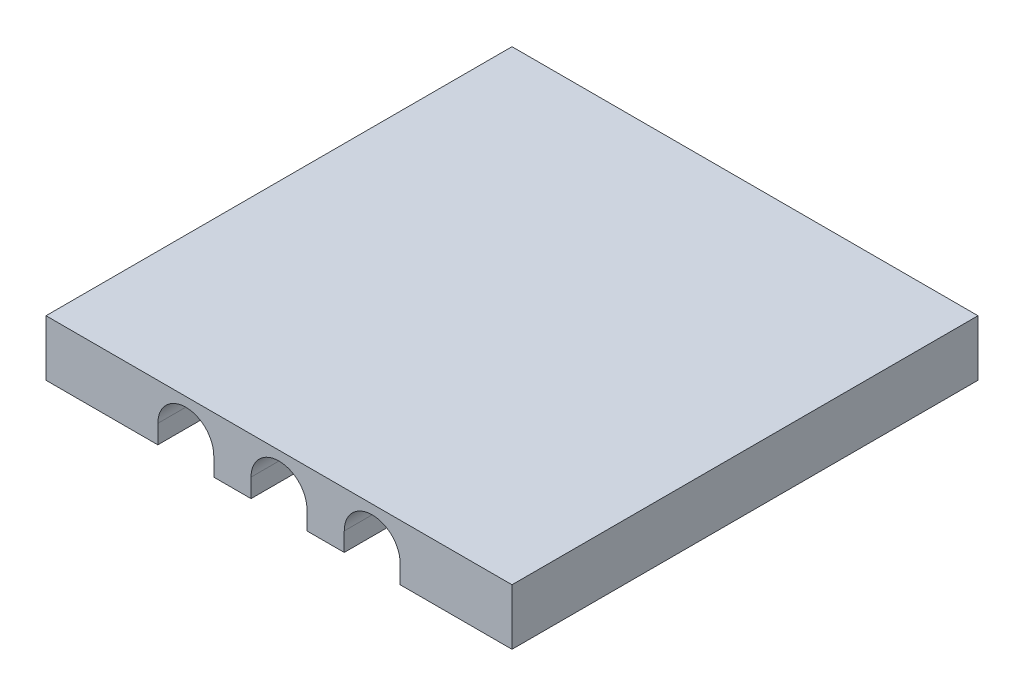
ISO-10303-21;
HEADER;
FILE_DESCRIPTION(('STEP AP214'),'2;1');
FILE_NAME('part.step','',(''),(''),'','','');
FILE_SCHEMA(('AUTOMOTIVE_DESIGN { 1 0 10303 214 1 1 1 1 }'));
ENDSEC;
DATA;
#1=APPLICATION_CONTEXT('core data for automotive mechanical design processes');
#2=APPLICATION_PROTOCOL_DEFINITION('international standard','automotive_design',2000,#1);
#3=PRODUCT_CONTEXT('',#1,'mechanical');
#4=PRODUCT('Part','Part','',(#3));
#5=PRODUCT_RELATED_PRODUCT_CATEGORY('part','',(#4));
#6=PRODUCT_DEFINITION_FORMATION('','',#4);
#7=PRODUCT_DEFINITION_CONTEXT('part definition',#1,'design');
#8=PRODUCT_DEFINITION('design','',#6,#7);
#9=PRODUCT_DEFINITION_SHAPE('','',#8);
#10=(LENGTH_UNIT() NAMED_UNIT(*) SI_UNIT(.MILLI.,.METRE.));
#11=(NAMED_UNIT(*) PLANE_ANGLE_UNIT() SI_UNIT($,.RADIAN.));
#12=(NAMED_UNIT(*) SI_UNIT($,.STERADIAN.) SOLID_ANGLE_UNIT());
#13=UNCERTAINTY_MEASURE_WITH_UNIT(LENGTH_MEASURE(1.E-05),#10,'distance_accuracy_value','');
#14=(GEOMETRIC_REPRESENTATION_CONTEXT(3) GLOBAL_UNCERTAINTY_ASSIGNED_CONTEXT((#13)) GLOBAL_UNIT_ASSIGNED_CONTEXT((#10,
#11,#12)) REPRESENTATION_CONTEXT('',''));
#15=CARTESIAN_POINT('',(0.,0.,0.));
#16=DIRECTION('',(0.,0.,1.));
#17=DIRECTION('',(1.,0.,0.));
#18=AXIS2_PLACEMENT_3D('',#15,#16,#17);
#19=CARTESIAN_POINT('',(-25.,-3.,25.));
#20=DIRECTION('',(0.,1.,0.));
#21=DIRECTION('',(0.,0.,1.));
#22=AXIS2_PLACEMENT_3D('',#19,#20,#21);
#23=PLANE('',#22);
#24=DIRECTION('',(1.,0.,0.));
#25=VECTOR('',#24,1.);
#26=CARTESIAN_POINT('',(-25.,-3.,25.));
#27=LINE('',#26,#25);
#28=CARTESIAN_POINT('',(-7.,-3.,25.));
#29=VERTEX_POINT('',#28);
#30=CARTESIAN_POINT('',(-3.,-3.,25.));
#31=VERTEX_POINT('',#30);
#32=EDGE_CURVE('E243',#29,#31,#27,.T.);
#33=ORIENTED_EDGE('',*,*,#32,.F.);
#34=DIRECTION('',(0.,0.,1.));
#35=VECTOR('',#34,1.);
#36=CARTESIAN_POINT('',(-7.,-3.,-25.001));
#37=LINE('',#36,#35);
#38=CARTESIAN_POINT('',(-7.,-3.,-25.));
#39=VERTEX_POINT('',#38);
#40=EDGE_CURVE('E179',#39,#29,#37,.T.);
#41=ORIENTED_EDGE('',*,*,#40,.F.);
#42=DIRECTION('',(1.,0.,0.));
#43=VECTOR('',#42,1.);
#44=CARTESIAN_POINT('',(-25.,-3.,-25.));
#45=LINE('',#44,#43);
#46=CARTESIAN_POINT('',(-3.,-3.,-25.));
#47=VERTEX_POINT('',#46);
#48=EDGE_CURVE('E253',#39,#47,#45,.T.);
#49=ORIENTED_EDGE('',*,*,#48,.T.);
#50=DIRECTION('',(0.,0.,1.));
#51=VECTOR('',#50,1.);
#52=CARTESIAN_POINT('',(-3.,-3.,-25.001));
#53=LINE('',#52,#51);
#54=EDGE_CURVE('E223',#47,#31,#53,.T.);
#55=ORIENTED_EDGE('',*,*,#54,.T.);
#56=EDGE_LOOP('',(#33,#41,#49,#55));
#57=FACE_BOUND('',#56,.T.);
#58=ADVANCED_FACE('F34',(#57),#23,.F.);
#59=CARTESIAN_POINT('',(13.,-3.,25.));
#60=VERTEX_POINT('',#59);
#61=CARTESIAN_POINT('',(25.,-3.,25.));
#62=VERTEX_POINT('',#61);
#63=EDGE_CURVE('E238',#60,#62,#27,.T.);
#64=ORIENTED_EDGE('',*,*,#63,.F.);
#65=DIRECTION('',(0.,0.,1.));
#66=VECTOR('',#65,1.);
#67=CARTESIAN_POINT('',(13.,-3.,-25.001));
#68=LINE('',#67,#66);
#69=CARTESIAN_POINT('',(13.,-3.,-25.));
#70=VERTEX_POINT('',#69);
#71=EDGE_CURVE('E198',#70,#60,#68,.T.);
#72=ORIENTED_EDGE('',*,*,#71,.F.);
#73=CARTESIAN_POINT('',(25.,-3.,-25.));
#74=VERTEX_POINT('',#73);
#75=EDGE_CURVE('E251',#70,#74,#45,.T.);
#76=ORIENTED_EDGE('',*,*,#75,.T.);
#77=DIRECTION('',(0.,0.,-1.));
#78=VECTOR('',#77,1.);
#79=CARTESIAN_POINT('',(25.,-3.,25.));
#80=LINE('',#79,#78);
#81=EDGE_CURVE('E242',#62,#74,#80,.T.);
#82=ORIENTED_EDGE('',*,*,#81,.F.);
#83=EDGE_LOOP('',(#64,#72,#76,#82));
#84=FACE_BOUND('',#83,.T.);
#85=ADVANCED_FACE('F304',(#84),#23,.F.);
#86=CARTESIAN_POINT('',(3.,-3.,-25.));
#87=VERTEX_POINT('',#86);
#88=CARTESIAN_POINT('',(7.,-3.,-25.));
#89=VERTEX_POINT('',#88);
#90=EDGE_CURVE('E254',#87,#89,#45,.T.);
#91=ORIENTED_EDGE('',*,*,#90,.T.);
#92=DIRECTION('',(0.,0.,1.));
#93=VECTOR('',#92,1.);
#94=CARTESIAN_POINT('',(7.,-3.,-25.001));
#95=LINE('',#94,#93);
#96=CARTESIAN_POINT('',(7.,-3.,25.));
#97=VERTEX_POINT('',#96);
#98=EDGE_CURVE('E57',#89,#97,#95,.T.);
#99=ORIENTED_EDGE('',*,*,#98,.T.);
#100=CARTESIAN_POINT('',(3.,-3.,25.));
#101=VERTEX_POINT('',#100);
#102=EDGE_CURVE('E244',#101,#97,#27,.T.);
#103=ORIENTED_EDGE('',*,*,#102,.F.);
#104=DIRECTION('',(0.,0.,1.));
#105=VECTOR('',#104,1.);
#106=CARTESIAN_POINT('',(3.,-3.,-25.001));
#107=LINE('',#106,#105);
#108=EDGE_CURVE('E221',#87,#101,#107,.T.);
#109=ORIENTED_EDGE('',*,*,#108,.F.);
#110=EDGE_LOOP('',(#91,#99,#103,#109));
#111=FACE_BOUND('',#110,.T.);
#112=ADVANCED_FACE('F306',(#111),#23,.F.);
#113=CARTESIAN_POINT('',(25.,3.,25.));
#114=DIRECTION('',(-1.,0.,0.));
#115=DIRECTION('',(0.,0.,1.));
#116=AXIS2_PLACEMENT_3D('',#113,#114,#115);
#117=PLANE('',#116);
#118=DIRECTION('',(0.,1.,0.));
#119=VECTOR('',#118,1.);
#120=CARTESIAN_POINT('',(25.,3.,-25.));
#121=LINE('',#120,#119);
#122=CARTESIAN_POINT('',(25.,3.,-25.));
#123=VERTEX_POINT('',#122);
#124=EDGE_CURVE('E229',#74,#123,#121,.T.);
#125=ORIENTED_EDGE('',*,*,#124,.T.);
#126=DIRECTION('',(0.,0.,-1.));
#127=VECTOR('',#126,1.);
#128=CARTESIAN_POINT('',(25.,3.,25.));
#129=LINE('',#128,#127);
#130=CARTESIAN_POINT('',(25.,3.,25.));
#131=VERTEX_POINT('',#130);
#132=EDGE_CURVE('E11',#131,#123,#129,.T.);
#133=ORIENTED_EDGE('',*,*,#132,.F.);
#134=DIRECTION('',(0.,1.,0.));
#135=VECTOR('',#134,1.);
#136=CARTESIAN_POINT('',(25.,3.,25.));
#137=LINE('',#136,#135);
#138=EDGE_CURVE('E230',#62,#131,#137,.T.);
#139=ORIENTED_EDGE('',*,*,#138,.F.);
#140=ORIENTED_EDGE('',*,*,#81,.T.);
#141=EDGE_LOOP('',(#125,#133,#139,#140));
#142=FACE_BOUND('',#141,.T.);
#143=ADVANCED_FACE('F36',(#142),#117,.F.);
#144=CARTESIAN_POINT('',(-25.,3.,25.));
#145=DIRECTION('',(0.,-1.,0.));
#146=DIRECTION('',(0.,0.,-1.));
#147=AXIS2_PLACEMENT_3D('',#144,#145,#146);
#148=PLANE('',#147);
#149=DIRECTION('',(-1.,0.,0.));
#150=VECTOR('',#149,1.);
#151=CARTESIAN_POINT('',(-25.,3.,-25.));
#152=LINE('',#151,#150);
#153=CARTESIAN_POINT('',(-25.,3.,-25.));
#154=VERTEX_POINT('',#153);
#155=EDGE_CURVE('E247',#123,#154,#152,.T.);
#156=ORIENTED_EDGE('',*,*,#155,.T.);
#157=DIRECTION('',(0.,0.,-1.));
#158=VECTOR('',#157,1.);
#159=CARTESIAN_POINT('',(-25.,3.,25.));
#160=LINE('',#159,#158);
#161=CARTESIAN_POINT('',(-25.,3.,25.));
#162=VERTEX_POINT('',#161);
#163=EDGE_CURVE('E42',#162,#154,#160,.T.);
#164=ORIENTED_EDGE('',*,*,#163,.F.);
#165=DIRECTION('',(-1.,0.,0.));
#166=VECTOR('',#165,1.);
#167=CARTESIAN_POINT('',(-25.,3.,25.));
#168=LINE('',#167,#166);
#169=EDGE_CURVE('E233',#131,#162,#168,.T.);
#170=ORIENTED_EDGE('',*,*,#169,.F.);
#171=ORIENTED_EDGE('',*,*,#132,.T.);
#172=EDGE_LOOP('',(#156,#164,#170,#171));
#173=FACE_BOUND('',#172,.T.);
#174=ADVANCED_FACE('F276',(#173),#148,.F.);
#175=CARTESIAN_POINT('',(-25.,3.,25.));
#176=DIRECTION('',(1.,0.,0.));
#177=DIRECTION('',(0.,0.,-1.));
#178=AXIS2_PLACEMENT_3D('',#175,#176,#177);
#179=PLANE('',#178);
#180=DIRECTION('',(0.,-1.,0.));
#181=VECTOR('',#180,1.);
#182=CARTESIAN_POINT('',(-25.,3.,-25.));
#183=LINE('',#182,#181);
#184=CARTESIAN_POINT('',(-25.,-3.,-25.));
#185=VERTEX_POINT('',#184);
#186=EDGE_CURVE('E249',#154,#185,#183,.T.);
#187=ORIENTED_EDGE('',*,*,#186,.T.);
#188=DIRECTION('',(0.,0.,-1.));
#189=VECTOR('',#188,1.);
#190=CARTESIAN_POINT('',(-25.,-3.,25.));
#191=LINE('',#190,#189);
#192=CARTESIAN_POINT('',(-25.,-3.,25.));
#193=VERTEX_POINT('',#192);
#194=EDGE_CURVE('E257',#193,#185,#191,.T.);
#195=ORIENTED_EDGE('',*,*,#194,.F.);
#196=DIRECTION('',(0.,-1.,0.));
#197=VECTOR('',#196,1.);
#198=CARTESIAN_POINT('',(-25.,3.,25.));
#199=LINE('',#198,#197);
#200=EDGE_CURVE('E236',#162,#193,#199,.T.);
#201=ORIENTED_EDGE('',*,*,#200,.F.);
#202=ORIENTED_EDGE('',*,*,#163,.T.);
#203=EDGE_LOOP('',(#187,#195,#201,#202));
#204=FACE_BOUND('',#203,.T.);
#205=ADVANCED_FACE('F264',(#204),#179,.F.);
#206=CARTESIAN_POINT('',(-13.,-3.,-25.));
#207=VERTEX_POINT('',#206);
#208=EDGE_CURVE('E234',#185,#207,#45,.T.);
#209=ORIENTED_EDGE('',*,*,#208,.T.);
#210=DIRECTION('',(0.,0.,1.));
#211=VECTOR('',#210,1.);
#212=CARTESIAN_POINT('',(-13.,-3.,-25.001));
#213=LINE('',#212,#211);
#214=CARTESIAN_POINT('',(-13.,-3.,25.));
#215=VERTEX_POINT('',#214);
#216=EDGE_CURVE('E49',#207,#215,#213,.T.);
#217=ORIENTED_EDGE('',*,*,#216,.T.);
#218=EDGE_CURVE('E239',#193,#215,#27,.T.);
#219=ORIENTED_EDGE('',*,*,#218,.F.);
#220=ORIENTED_EDGE('',*,*,#194,.T.);
#221=EDGE_LOOP('',(#209,#217,#219,#220));
#222=FACE_BOUND('',#221,.T.);
#223=ADVANCED_FACE('F269',(#222),#23,.F.);
#224=CARTESIAN_POINT('',(0.,0.,25.));
#225=DIRECTION('',(0.,0.,1.));
#226=DIRECTION('',(1.,0.,0.));
#227=AXIS2_PLACEMENT_3D('',#224,#225,#226);
#228=PLANE('',#227);
#229=DIRECTION('',(0.,1.,0.));
#230=VECTOR('',#229,1.);
#231=CARTESIAN_POINT('',(-7.,-1.,25.));
#232=LINE('',#231,#230);
#233=CARTESIAN_POINT('',(-7.,-1.,25.));
#234=VERTEX_POINT('',#233);
#235=EDGE_CURVE('E157',#29,#234,#232,.T.);
#236=ORIENTED_EDGE('',*,*,#235,.F.);
#237=ORIENTED_EDGE('',*,*,#32,.T.);
#238=DIRECTION('',(0.,-1.,0.));
#239=VECTOR('',#238,1.);
#240=CARTESIAN_POINT('',(-3.,-1.,25.));
#241=LINE('',#240,#239);
#242=CARTESIAN_POINT('',(-3.,-1.,25.));
#243=VERTEX_POINT('',#242);
#244=EDGE_CURVE('E211',#243,#31,#241,.T.);
#245=ORIENTED_EDGE('',*,*,#244,.F.);
#246=CARTESIAN_POINT('',(0.,-1.,25.));
#247=DIRECTION('',(0.,0.,1.));
#248=DIRECTION('',(1.,0.,0.));
#249=AXIS2_PLACEMENT_3D('',#246,#247,#248);
#250=CIRCLE('',#249,3.);
#251=CARTESIAN_POINT('',(3.,-1.,25.));
#252=VERTEX_POINT('',#251);
#253=EDGE_CURVE('E208',#252,#243,#250,.T.);
#254=ORIENTED_EDGE('',*,*,#253,.F.);
#255=DIRECTION('',(0.,1.,0.));
#256=VECTOR('',#255,1.);
#257=CARTESIAN_POINT('',(3.,-1.,25.));
#258=LINE('',#257,#256);
#259=EDGE_CURVE('E214',#101,#252,#258,.T.);
#260=ORIENTED_EDGE('',*,*,#259,.F.);
#261=ORIENTED_EDGE('',*,*,#102,.T.);
#262=DIRECTION('',(0.,-1.,0.));
#263=VECTOR('',#262,1.);
#264=CARTESIAN_POINT('',(7.,-1.,25.));
#265=LINE('',#264,#263);
#266=CARTESIAN_POINT('',(7.,-1.,25.));
#267=VERTEX_POINT('',#266);
#268=EDGE_CURVE('E189',#267,#97,#265,.T.);
#269=ORIENTED_EDGE('',*,*,#268,.F.);
#270=CARTESIAN_POINT('',(10.,-1.,25.));
#271=DIRECTION('',(0.,0.,1.));
#272=DIRECTION('',(1.,0.,0.));
#273=AXIS2_PLACEMENT_3D('',#270,#271,#272);
#274=CIRCLE('',#273,3.);
#275=CARTESIAN_POINT('',(13.,-1.,25.));
#276=VERTEX_POINT('',#275);
#277=EDGE_CURVE('E186',#276,#267,#274,.T.);
#278=ORIENTED_EDGE('',*,*,#277,.F.);
#279=DIRECTION('',(0.,1.,0.));
#280=VECTOR('',#279,1.);
#281=CARTESIAN_POINT('',(13.,-1.,25.));
#282=LINE('',#281,#280);
#283=EDGE_CURVE('E191',#60,#276,#282,.T.);
#284=ORIENTED_EDGE('',*,*,#283,.F.);
#285=ORIENTED_EDGE('',*,*,#63,.T.);
#286=ORIENTED_EDGE('',*,*,#138,.T.);
#287=ORIENTED_EDGE('',*,*,#169,.T.);
#288=ORIENTED_EDGE('',*,*,#200,.T.);
#289=ORIENTED_EDGE('',*,*,#218,.T.);
#290=DIRECTION('',(0.,-1.,0.));
#291=VECTOR('',#290,1.);
#292=CARTESIAN_POINT('',(-13.,-1.,25.));
#293=LINE('',#292,#291);
#294=CARTESIAN_POINT('',(-13.,-1.,25.));
#295=VERTEX_POINT('',#294);
#296=EDGE_CURVE('E174',#295,#215,#293,.T.);
#297=ORIENTED_EDGE('',*,*,#296,.F.);
#298=CARTESIAN_POINT('',(-10.,-1.,25.));
#299=DIRECTION('',(0.,0.,1.));
#300=DIRECTION('',(1.,0.,0.));
#301=AXIS2_PLACEMENT_3D('',#298,#299,#300);
#302=CIRCLE('',#301,3.);
#303=EDGE_CURVE('E155',#234,#295,#302,.T.);
#304=ORIENTED_EDGE('',*,*,#303,.F.);
#305=EDGE_LOOP('',(#236,#237,#245,#254,#260,#261,#269,#278,#284,#285,#286,#287,#288,#289,#297,#304));
#306=FACE_BOUND('',#305,.T.);
#307=ADVANCED_FACE('F273',(#306),#228,.T.);
#308=CARTESIAN_POINT('',(0.,0.,-25.));
#309=DIRECTION('',(0.,0.,1.));
#310=DIRECTION('',(1.,0.,0.));
#311=AXIS2_PLACEMENT_3D('',#308,#309,#310);
#312=PLANE('',#311);
#313=ORIENTED_EDGE('',*,*,#48,.F.);
#314=DIRECTION('',(0.,-1.,0.));
#315=VECTOR('',#314,1.);
#316=CARTESIAN_POINT('',(-7.,-1.,-25.));
#317=LINE('',#316,#315);
#318=CARTESIAN_POINT('',(-7.,-1.,-25.));
#319=VERTEX_POINT('',#318);
#320=EDGE_CURVE('E169',#319,#39,#317,.T.);
#321=ORIENTED_EDGE('',*,*,#320,.F.);
#322=CARTESIAN_POINT('',(-10.,-1.,-25.));
#323=DIRECTION('',(0.,0.,1.));
#324=DIRECTION('',(1.,0.,0.));
#325=AXIS2_PLACEMENT_3D('',#322,#323,#324);
#326=CIRCLE('',#325,3.);
#327=CARTESIAN_POINT('',(-13.,-1.,-25.));
#328=VERTEX_POINT('',#327);
#329=EDGE_CURVE('E152',#328,#319,#326,.F.);
#330=ORIENTED_EDGE('',*,*,#329,.F.);
#331=DIRECTION('',(0.,1.,0.));
#332=VECTOR('',#331,1.);
#333=CARTESIAN_POINT('',(-13.,-1.,-25.));
#334=LINE('',#333,#332);
#335=EDGE_CURVE('E159',#207,#328,#334,.T.);
#336=ORIENTED_EDGE('',*,*,#335,.F.);
#337=ORIENTED_EDGE('',*,*,#208,.F.);
#338=ORIENTED_EDGE('',*,*,#186,.F.);
#339=ORIENTED_EDGE('',*,*,#155,.F.);
#340=ORIENTED_EDGE('',*,*,#124,.F.);
#341=ORIENTED_EDGE('',*,*,#75,.F.);
#342=DIRECTION('',(0.,-1.,0.));
#343=VECTOR('',#342,1.);
#344=CARTESIAN_POINT('',(13.,-1.,-25.));
#345=LINE('',#344,#343);
#346=CARTESIAN_POINT('',(13.,-1.,-25.));
#347=VERTEX_POINT('',#346);
#348=EDGE_CURVE('E184',#347,#70,#345,.T.);
#349=ORIENTED_EDGE('',*,*,#348,.F.);
#350=CARTESIAN_POINT('',(10.,-1.,-25.));
#351=DIRECTION('',(0.,0.,1.));
#352=DIRECTION('',(1.,0.,0.));
#353=AXIS2_PLACEMENT_3D('',#350,#351,#352);
#354=CIRCLE('',#353,3.);
#355=CARTESIAN_POINT('',(7.,-1.,-25.));
#356=VERTEX_POINT('',#355);
#357=EDGE_CURVE('E164',#356,#347,#354,.F.);
#358=ORIENTED_EDGE('',*,*,#357,.F.);
#359=DIRECTION('',(0.,1.,0.));
#360=VECTOR('',#359,1.);
#361=CARTESIAN_POINT('',(7.,-1.,-25.));
#362=LINE('',#361,#360);
#363=EDGE_CURVE('E197',#89,#356,#362,.T.);
#364=ORIENTED_EDGE('',*,*,#363,.F.);
#365=ORIENTED_EDGE('',*,*,#90,.F.);
#366=DIRECTION('',(0.,-1.,0.));
#367=VECTOR('',#366,1.);
#368=CARTESIAN_POINT('',(3.,-1.,-25.));
#369=LINE('',#368,#367);
#370=CARTESIAN_POINT('',(3.,-1.,-25.));
#371=VERTEX_POINT('',#370);
#372=EDGE_CURVE('E206',#371,#87,#369,.T.);
#373=ORIENTED_EDGE('',*,*,#372,.F.);
#374=CARTESIAN_POINT('',(0.,-1.,-25.));
#375=DIRECTION('',(0.,0.,1.));
#376=DIRECTION('',(1.,0.,0.));
#377=AXIS2_PLACEMENT_3D('',#374,#375,#376);
#378=CIRCLE('',#377,3.);
#379=CARTESIAN_POINT('',(-3.,-1.,-25.));
#380=VERTEX_POINT('',#379);
#381=EDGE_CURVE('E203',#380,#371,#378,.F.);
#382=ORIENTED_EDGE('',*,*,#381,.F.);
#383=DIRECTION('',(0.,1.,0.));
#384=VECTOR('',#383,1.);
#385=CARTESIAN_POINT('',(-3.,-1.,-25.));
#386=LINE('',#385,#384);
#387=EDGE_CURVE('E220',#47,#380,#386,.T.);
#388=ORIENTED_EDGE('',*,*,#387,.F.);
#389=EDGE_LOOP('',(#313,#321,#330,#336,#337,#338,#339,#340,#341,#349,#358,#364,#365,#373,#382,#388));
#390=FACE_BOUND('',#389,.T.);
#391=ADVANCED_FACE('F168',(#390),#312,.F.);
#392=CARTESIAN_POINT('',(0.,-1.,-25.001));
#393=DIRECTION('',(0.,0.,1.));
#394=DIRECTION('',(1.,0.,0.));
#395=AXIS2_PLACEMENT_3D('',#392,#393,#394);
#396=CYLINDRICAL_SURFACE('',#395,3.);
#397=ORIENTED_EDGE('',*,*,#381,.T.);
#398=DIRECTION('',(0.,0.,1.));
#399=VECTOR('',#398,1.);
#400=CARTESIAN_POINT('',(3.,-1.,-25.001));
#401=LINE('',#400,#399);
#402=EDGE_CURVE('E218',#371,#252,#401,.T.);
#403=ORIENTED_EDGE('',*,*,#402,.T.);
#404=ORIENTED_EDGE('',*,*,#253,.T.);
#405=DIRECTION('',(0.,0.,1.));
#406=VECTOR('',#405,1.);
#407=CARTESIAN_POINT('',(-3.,-1.,-25.001));
#408=LINE('',#407,#406);
#409=EDGE_CURVE('E217',#380,#243,#408,.T.);
#410=ORIENTED_EDGE('',*,*,#409,.F.);
#411=EDGE_LOOP('',(#397,#403,#404,#410));
#412=FACE_BOUND('',#411,.T.);
#413=ADVANCED_FACE('F297',(#412),#396,.F.);
#414=CARTESIAN_POINT('',(3.,-1.,-25.001));
#415=DIRECTION('',(1.,0.,0.));
#416=DIRECTION('',(0.,1.,0.));
#417=AXIS2_PLACEMENT_3D('',#414,#415,#416);
#418=PLANE('',#417);
#419=ORIENTED_EDGE('',*,*,#372,.T.);
#420=ORIENTED_EDGE('',*,*,#108,.T.);
#421=ORIENTED_EDGE('',*,*,#259,.T.);
#422=ORIENTED_EDGE('',*,*,#402,.F.);
#423=EDGE_LOOP('',(#419,#420,#421,#422));
#424=FACE_BOUND('',#423,.T.);
#425=ADVANCED_FACE('F416',(#424),#418,.F.);
#426=CARTESIAN_POINT('',(-3.,-1.,-25.001));
#427=DIRECTION('',(-1.,0.,0.));
#428=DIRECTION('',(0.,-1.,0.));
#429=AXIS2_PLACEMENT_3D('',#426,#427,#428);
#430=PLANE('',#429);
#431=ORIENTED_EDGE('',*,*,#387,.T.);
#432=ORIENTED_EDGE('',*,*,#409,.T.);
#433=ORIENTED_EDGE('',*,*,#244,.T.);
#434=ORIENTED_EDGE('',*,*,#54,.F.);
#435=EDGE_LOOP('',(#431,#432,#433,#434));
#436=FACE_BOUND('',#435,.T.);
#437=ADVANCED_FACE('F291',(#436),#430,.F.);
#438=CARTESIAN_POINT('',(10.,-1.,-25.001));
#439=DIRECTION('',(0.,0.,1.));
#440=DIRECTION('',(1.,0.,0.));
#441=AXIS2_PLACEMENT_3D('',#438,#439,#440);
#442=CYLINDRICAL_SURFACE('',#441,3.);
#443=ORIENTED_EDGE('',*,*,#357,.T.);
#444=DIRECTION('',(0.,0.,1.));
#445=VECTOR('',#444,1.);
#446=CARTESIAN_POINT('',(13.,-1.,-25.001));
#447=LINE('',#446,#445);
#448=EDGE_CURVE('E195',#347,#276,#447,.T.);
#449=ORIENTED_EDGE('',*,*,#448,.T.);
#450=ORIENTED_EDGE('',*,*,#277,.T.);
#451=DIRECTION('',(0.,0.,1.));
#452=VECTOR('',#451,1.);
#453=CARTESIAN_POINT('',(7.,-1.,-25.001));
#454=LINE('',#453,#452);
#455=EDGE_CURVE('E194',#356,#267,#454,.T.);
#456=ORIENTED_EDGE('',*,*,#455,.F.);
#457=EDGE_LOOP('',(#443,#449,#450,#456));
#458=FACE_BOUND('',#457,.T.);
#459=ADVANCED_FACE('F359',(#458),#442,.F.);
#460=CARTESIAN_POINT('',(13.,-1.,-25.001));
#461=DIRECTION('',(1.,0.,0.));
#462=DIRECTION('',(0.,1.,0.));
#463=AXIS2_PLACEMENT_3D('',#460,#461,#462);
#464=PLANE('',#463);
#465=ORIENTED_EDGE('',*,*,#348,.T.);
#466=ORIENTED_EDGE('',*,*,#71,.T.);
#467=ORIENTED_EDGE('',*,*,#283,.T.);
#468=ORIENTED_EDGE('',*,*,#448,.F.);
#469=EDGE_LOOP('',(#465,#466,#467,#468));
#470=FACE_BOUND('',#469,.T.);
#471=ADVANCED_FACE('F364',(#470),#464,.F.);
#472=CARTESIAN_POINT('',(7.,-1.,-25.001));
#473=DIRECTION('',(-1.,0.,0.));
#474=DIRECTION('',(0.,-1.,0.));
#475=AXIS2_PLACEMENT_3D('',#472,#473,#474);
#476=PLANE('',#475);
#477=ORIENTED_EDGE('',*,*,#363,.T.);
#478=ORIENTED_EDGE('',*,*,#455,.T.);
#479=ORIENTED_EDGE('',*,*,#268,.T.);
#480=ORIENTED_EDGE('',*,*,#98,.F.);
#481=EDGE_LOOP('',(#477,#478,#479,#480));
#482=FACE_BOUND('',#481,.T.);
#483=ADVANCED_FACE('F376',(#482),#476,.F.);
#484=CARTESIAN_POINT('',(-10.,-1.,-25.001));
#485=DIRECTION('',(0.,0.,1.));
#486=DIRECTION('',(1.,0.,0.));
#487=AXIS2_PLACEMENT_3D('',#484,#485,#486);
#488=CYLINDRICAL_SURFACE('',#487,3.);
#489=ORIENTED_EDGE('',*,*,#329,.T.);
#490=DIRECTION('',(0.,0.,1.));
#491=VECTOR('',#490,1.);
#492=CARTESIAN_POINT('',(-7.,-1.,-25.001));
#493=LINE('',#492,#491);
#494=EDGE_CURVE('E165',#319,#234,#493,.T.);
#495=ORIENTED_EDGE('',*,*,#494,.T.);
#496=ORIENTED_EDGE('',*,*,#303,.T.);
#497=DIRECTION('',(0.,0.,1.));
#498=VECTOR('',#497,1.);
#499=CARTESIAN_POINT('',(-13.,-1.,-25.001));
#500=LINE('',#499,#498);
#501=EDGE_CURVE('E149',#328,#295,#500,.T.);
#502=ORIENTED_EDGE('',*,*,#501,.F.);
#503=EDGE_LOOP('',(#489,#495,#496,#502));
#504=FACE_BOUND('',#503,.T.);
#505=ADVANCED_FACE('F150',(#504),#488,.F.);
#506=CARTESIAN_POINT('',(-7.,-1.,-25.001));
#507=DIRECTION('',(1.,0.,0.));
#508=DIRECTION('',(0.,1.,0.));
#509=AXIS2_PLACEMENT_3D('',#506,#507,#508);
#510=PLANE('',#509);
#511=ORIENTED_EDGE('',*,*,#320,.T.);
#512=ORIENTED_EDGE('',*,*,#40,.T.);
#513=ORIENTED_EDGE('',*,*,#235,.T.);
#514=ORIENTED_EDGE('',*,*,#494,.F.);
#515=EDGE_LOOP('',(#511,#512,#513,#514));
#516=FACE_BOUND('',#515,.T.);
#517=ADVANCED_FACE('F394',(#516),#510,.F.);
#518=CARTESIAN_POINT('',(-13.,-1.,-25.001));
#519=DIRECTION('',(-1.,0.,0.));
#520=DIRECTION('',(0.,-1.,0.));
#521=AXIS2_PLACEMENT_3D('',#518,#519,#520);
#522=PLANE('',#521);
#523=ORIENTED_EDGE('',*,*,#335,.T.);
#524=ORIENTED_EDGE('',*,*,#501,.T.);
#525=ORIENTED_EDGE('',*,*,#296,.T.);
#526=ORIENTED_EDGE('',*,*,#216,.F.);
#527=EDGE_LOOP('',(#523,#524,#525,#526));
#528=FACE_BOUND('',#527,.T.);
#529=ADVANCED_FACE('F160',(#528),#522,.F.);
#530=CLOSED_SHELL('',(#58,#85,#112,#143,#174,#205,#223,#307,#391,#413,#425,#437,#459,#471,#483,
#505,#517,#529));
#531=MANIFOLD_SOLID_BREP('B2',#530);
#532=ADVANCED_BREP_SHAPE_REPRESENTATION('',(#18,#531),#14);
#533=SHAPE_DEFINITION_REPRESENTATION(#9,#532);
ENDSEC;
END-ISO-10303-21;
